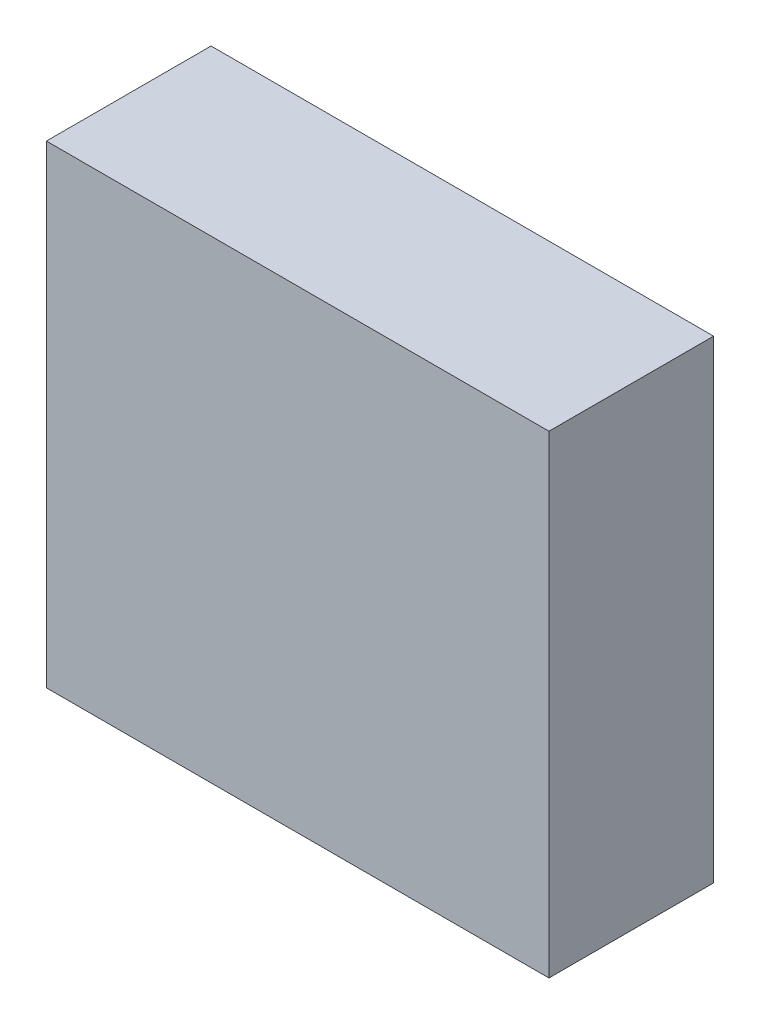
ISO-10303-21;
HEADER;
FILE_DESCRIPTION(('STEP AP214'),'2;1');
FILE_NAME('part.step','',(''),(''),'','','');
FILE_SCHEMA(('AUTOMOTIVE_DESIGN { 1 0 10303 214 1 1 1 1 }'));
ENDSEC;
DATA;
#1=APPLICATION_CONTEXT('core data for automotive mechanical design processes');
#2=APPLICATION_PROTOCOL_DEFINITION('international standard','automotive_design',2000,#1);
#3=PRODUCT_CONTEXT('',#1,'mechanical');
#4=PRODUCT('Part','Part','',(#3));
#5=PRODUCT_RELATED_PRODUCT_CATEGORY('part','',(#4));
#6=PRODUCT_DEFINITION_FORMATION('','',#4);
#7=PRODUCT_DEFINITION_CONTEXT('part definition',#1,'design');
#8=PRODUCT_DEFINITION('design','',#6,#7);
#9=PRODUCT_DEFINITION_SHAPE('','',#8);
#10=(LENGTH_UNIT() NAMED_UNIT(*) SI_UNIT(.MILLI.,.METRE.));
#11=(NAMED_UNIT(*) PLANE_ANGLE_UNIT() SI_UNIT($,.RADIAN.));
#12=(NAMED_UNIT(*) SI_UNIT($,.STERADIAN.) SOLID_ANGLE_UNIT());
#13=UNCERTAINTY_MEASURE_WITH_UNIT(LENGTH_MEASURE(1.E-05),#10,'distance_accuracy_value','');
#14=(GEOMETRIC_REPRESENTATION_CONTEXT(3) GLOBAL_UNCERTAINTY_ASSIGNED_CONTEXT((#13)) GLOBAL_UNIT_ASSIGNED_CONTEXT((#10,
#11,#12)) REPRESENTATION_CONTEXT('',''));
#15=CARTESIAN_POINT('',(0.,0.,0.));
#16=DIRECTION('',(0.,0.,1.));
#17=DIRECTION('',(1.,0.,0.));
#18=AXIS2_PLACEMENT_3D('',#15,#16,#17);
#19=CARTESIAN_POINT('',(-1.5262,-1.4,1.));
#20=DIRECTION('',(1.,0.,0.));
#21=DIRECTION('',(0.,0.,-1.));
#22=AXIS2_PLACEMENT_3D('',#19,#20,#21);
#23=PLANE('',#22);
#24=DIRECTION('',(0.,-1.,0.));
#25=VECTOR('',#24,1.);
#26=CARTESIAN_POINT('',(-1.5262,-1.4,0.));
#27=LINE('',#26,#25);
#28=CARTESIAN_POINT('',(-1.5262,1.4762,0.));
#29=VERTEX_POINT('',#28);
#30=CARTESIAN_POINT('',(-1.5262,-1.4,0.));
#31=VERTEX_POINT('',#30);
#32=EDGE_CURVE('E96',#29,#31,#27,.T.);
#33=ORIENTED_EDGE('',*,*,#32,.T.);
#34=DIRECTION('',(0.,0.,-1.));
#35=VECTOR('',#34,1.);
#36=CARTESIAN_POINT('',(-1.5262,-1.4,1.));
#37=LINE('',#36,#35);
#38=CARTESIAN_POINT('',(-1.5262,-1.4,1.));
#39=VERTEX_POINT('',#38);
#40=EDGE_CURVE('E11',#39,#31,#37,.T.);
#41=ORIENTED_EDGE('',*,*,#40,.F.);
#42=DIRECTION('',(0.,-1.,0.));
#43=VECTOR('',#42,1.);
#44=CARTESIAN_POINT('',(-1.5262,-1.4,1.));
#45=LINE('',#44,#43);
#46=CARTESIAN_POINT('',(-1.5262,1.4762,1.));
#47=VERTEX_POINT('',#46);
#48=EDGE_CURVE('E84',#47,#39,#45,.T.);
#49=ORIENTED_EDGE('',*,*,#48,.F.);
#50=DIRECTION('',(0.,0.,-1.));
#51=VECTOR('',#50,1.);
#52=CARTESIAN_POINT('',(-1.5262,1.4762,1.));
#53=LINE('',#52,#51);
#54=EDGE_CURVE('E92',#47,#29,#53,.T.);
#55=ORIENTED_EDGE('',*,*,#54,.T.);
#56=EDGE_LOOP('',(#33,#41,#49,#55));
#57=FACE_BOUND('',#56,.T.);
#58=ADVANCED_FACE('F33',(#57),#23,.F.);
#59=CARTESIAN_POINT('',(1.5262,-1.4,1.));
#60=DIRECTION('',(0.,1.,0.));
#61=DIRECTION('',(0.,0.,1.));
#62=AXIS2_PLACEMENT_3D('',#59,#60,#61);
#63=PLANE('',#62);
#64=DIRECTION('',(1.,0.,0.));
#65=VECTOR('',#64,1.);
#66=CARTESIAN_POINT('',(1.5262,-1.4,0.));
#67=LINE('',#66,#65);
#68=CARTESIAN_POINT('',(1.5262,-1.4,0.));
#69=VERTEX_POINT('',#68);
#70=EDGE_CURVE('E88',#31,#69,#67,.T.);
#71=ORIENTED_EDGE('',*,*,#70,.T.);
#72=DIRECTION('',(0.,0.,-1.));
#73=VECTOR('',#72,1.);
#74=CARTESIAN_POINT('',(1.5262,-1.4,1.));
#75=LINE('',#74,#73);
#76=CARTESIAN_POINT('',(1.5262,-1.4,1.));
#77=VERTEX_POINT('',#76);
#78=EDGE_CURVE('E41',#77,#69,#75,.T.);
#79=ORIENTED_EDGE('',*,*,#78,.F.);
#80=DIRECTION('',(1.,0.,0.));
#81=VECTOR('',#80,1.);
#82=CARTESIAN_POINT('',(1.5262,-1.4,1.));
#83=LINE('',#82,#81);
#84=EDGE_CURVE('E79',#39,#77,#83,.T.);
#85=ORIENTED_EDGE('',*,*,#84,.F.);
#86=ORIENTED_EDGE('',*,*,#40,.T.);
#87=EDGE_LOOP('',(#71,#79,#85,#86));
#88=FACE_BOUND('',#87,.T.);
#89=ADVANCED_FACE('F87',(#88),#63,.F.);
#90=CARTESIAN_POINT('',(1.5262,1.4762,1.));
#91=DIRECTION('',(-1.,0.,0.));
#92=DIRECTION('',(0.,0.,1.));
#93=AXIS2_PLACEMENT_3D('',#90,#91,#92);
#94=PLANE('',#93);
#95=DIRECTION('',(0.,1.,0.));
#96=VECTOR('',#95,1.);
#97=CARTESIAN_POINT('',(1.5262,1.4762,0.));
#98=LINE('',#97,#96);
#99=CARTESIAN_POINT('',(1.5262,1.4762,0.));
#100=VERTEX_POINT('',#99);
#101=EDGE_CURVE('E66',#69,#100,#98,.T.);
#102=ORIENTED_EDGE('',*,*,#101,.T.);
#103=DIRECTION('',(0.,0.,-1.));
#104=VECTOR('',#103,1.);
#105=CARTESIAN_POINT('',(1.5262,1.4762,1.));
#106=LINE('',#105,#104);
#107=CARTESIAN_POINT('',(1.5262,1.4762,1.));
#108=VERTEX_POINT('',#107);
#109=EDGE_CURVE('E89',#108,#100,#106,.T.);
#110=ORIENTED_EDGE('',*,*,#109,.F.);
#111=DIRECTION('',(0.,1.,0.));
#112=VECTOR('',#111,1.);
#113=CARTESIAN_POINT('',(1.5262,1.4762,1.));
#114=LINE('',#113,#112);
#115=EDGE_CURVE('E82',#77,#108,#114,.T.);
#116=ORIENTED_EDGE('',*,*,#115,.F.);
#117=ORIENTED_EDGE('',*,*,#78,.T.);
#118=EDGE_LOOP('',(#102,#110,#116,#117));
#119=FACE_BOUND('',#118,.T.);
#120=ADVANCED_FACE('F90',(#119),#94,.F.);
#121=CARTESIAN_POINT('',(-1.5262,1.4762,1.));
#122=DIRECTION('',(0.,-1.,0.));
#123=DIRECTION('',(0.,0.,-1.));
#124=AXIS2_PLACEMENT_3D('',#121,#122,#123);
#125=PLANE('',#124);
#126=DIRECTION('',(-1.,0.,0.));
#127=VECTOR('',#126,1.);
#128=CARTESIAN_POINT('',(-1.5262,1.4762,0.));
#129=LINE('',#128,#127);
#130=EDGE_CURVE('E72',#100,#29,#129,.T.);
#131=ORIENTED_EDGE('',*,*,#130,.T.);
#132=ORIENTED_EDGE('',*,*,#54,.F.);
#133=DIRECTION('',(-1.,0.,0.));
#134=VECTOR('',#133,1.);
#135=CARTESIAN_POINT('',(-1.5262,1.4762,1.));
#136=LINE('',#135,#134);
#137=EDGE_CURVE('E49',#108,#47,#136,.T.);
#138=ORIENTED_EDGE('',*,*,#137,.F.);
#139=ORIENTED_EDGE('',*,*,#109,.T.);
#140=EDGE_LOOP('',(#131,#132,#138,#139));
#141=FACE_BOUND('',#140,.T.);
#142=ADVANCED_FACE('F103',(#141),#125,.F.);
#143=CARTESIAN_POINT('',(0.,0.,1.));
#144=DIRECTION('',(0.,0.,-1.));
#145=DIRECTION('',(-1.,0.,0.));
#146=AXIS2_PLACEMENT_3D('',#143,#144,#145);
#147=PLANE('',#146);
#148=ORIENTED_EDGE('',*,*,#48,.T.);
#149=ORIENTED_EDGE('',*,*,#84,.T.);
#150=ORIENTED_EDGE('',*,*,#115,.T.);
#151=ORIENTED_EDGE('',*,*,#137,.T.);
#152=EDGE_LOOP('',(#148,#149,#150,#151));
#153=FACE_BOUND('',#152,.T.);
#154=ADVANCED_FACE('F80',(#153),#147,.F.);
#155=CARTESIAN_POINT('',(0.,0.,0.));
#156=DIRECTION('',(0.,0.,-1.));
#157=DIRECTION('',(-1.,0.,0.));
#158=AXIS2_PLACEMENT_3D('',#155,#156,#157);
#159=PLANE('',#158);
#160=ORIENTED_EDGE('',*,*,#32,.F.);
#161=ORIENTED_EDGE('',*,*,#130,.F.);
#162=ORIENTED_EDGE('',*,*,#101,.F.);
#163=ORIENTED_EDGE('',*,*,#70,.F.);
#164=EDGE_LOOP('',(#160,#161,#162,#163));
#165=FACE_BOUND('',#164,.T.);
#166=ADVANCED_FACE('F106',(#165),#159,.T.);
#167=CLOSED_SHELL('',(#58,#89,#120,#142,#154,#166));
#168=MANIFOLD_SOLID_BREP('B2',#167);
#169=ADVANCED_BREP_SHAPE_REPRESENTATION('',(#18,#168),#14);
#170=SHAPE_DEFINITION_REPRESENTATION(#9,#169);
ENDSEC;
END-ISO-10303-21;
